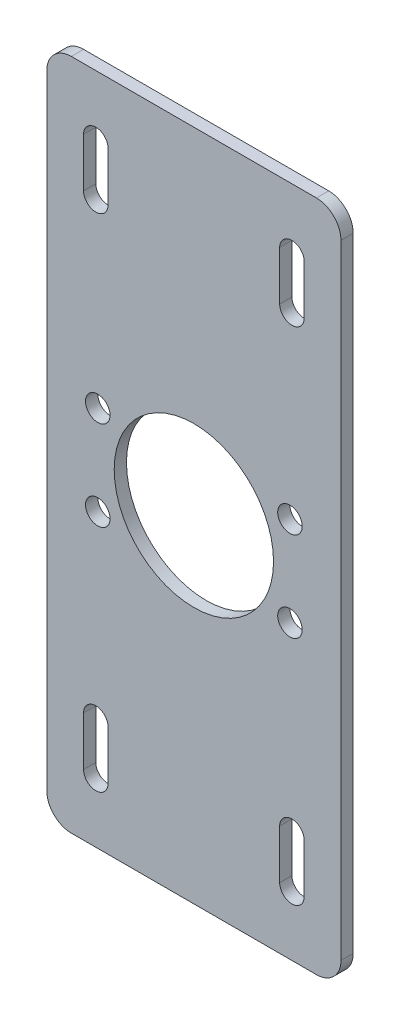
ISO-10303-21;
HEADER;
FILE_DESCRIPTION(('STEP AP214'),'2;1');
FILE_NAME('part.step','',(''),(''),'','','');
FILE_SCHEMA(('AUTOMOTIVE_DESIGN { 1 0 10303 214 1 1 1 1 }'));
ENDSEC;
DATA;
#1=APPLICATION_CONTEXT('core data for automotive mechanical design processes');
#2=APPLICATION_PROTOCOL_DEFINITION('international standard','automotive_design',2000,#1);
#3=PRODUCT_CONTEXT('',#1,'mechanical');
#4=PRODUCT('Part','Part','',(#3));
#5=PRODUCT_RELATED_PRODUCT_CATEGORY('part','',(#4));
#6=PRODUCT_DEFINITION_FORMATION('','',#4);
#7=PRODUCT_DEFINITION_CONTEXT('part definition',#1,'design');
#8=PRODUCT_DEFINITION('design','',#6,#7);
#9=PRODUCT_DEFINITION_SHAPE('','',#8);
#10=(LENGTH_UNIT() NAMED_UNIT(*) SI_UNIT(.MILLI.,.METRE.));
#11=(NAMED_UNIT(*) PLANE_ANGLE_UNIT() SI_UNIT($,.RADIAN.));
#12=(NAMED_UNIT(*) SI_UNIT($,.STERADIAN.) SOLID_ANGLE_UNIT());
#13=UNCERTAINTY_MEASURE_WITH_UNIT(LENGTH_MEASURE(1.E-05),#10,'distance_accuracy_value','');
#14=(GEOMETRIC_REPRESENTATION_CONTEXT(3) GLOBAL_UNCERTAINTY_ASSIGNED_CONTEXT((#13)) GLOBAL_UNIT_ASSIGNED_CONTEXT((#10,
#11,#12)) REPRESENTATION_CONTEXT('',''));
#15=CARTESIAN_POINT('',(0.,0.,0.));
#16=DIRECTION('',(0.,0.,1.));
#17=DIRECTION('',(1.,0.,0.));
#18=AXIS2_PLACEMENT_3D('',#15,#16,#17);
#19=CARTESIAN_POINT('',(0.,0.,171.45));
#20=DIRECTION('',(0.,0.,1.));
#21=DIRECTION('',(1.,0.,0.));
#22=AXIS2_PLACEMENT_3D('',#19,#20,#21);
#23=PLANE('',#22);
#24=CARTESIAN_POINT('',(-24.8906104862277,774.362823261769,171.45));
#25=DIRECTION('',(0.,0.,1.));
#26=DIRECTION('',(1.,0.,0.));
#27=AXIS2_PLACEMENT_3D('',#24,#25,#26);
#28=CIRCLE('',#27,3.17499999999992);
#29=CARTESIAN_POINT('',(-21.7156104862278,774.362823261769,171.45));
#30=VERTEX_POINT('',#29);
#31=EDGE_CURVE('E397',#30,#30,#28,.T.);
#32=ORIENTED_EDGE('',*,*,#31,.F.);
#33=EDGE_LOOP('',(#32));
#34=FACE_BOUND('',#33,.T.);
#35=CARTESIAN_POINT('',(24.8906104862278,774.362823261769,171.45));
#36=DIRECTION('',(0.,0.,1.));
#37=DIRECTION('',(1.,0.,0.));
#38=AXIS2_PLACEMENT_3D('',#35,#36,#37);
#39=CIRCLE('',#38,3.175);
#40=CARTESIAN_POINT('',(28.0656104862278,774.362823261769,171.45));
#41=VERTEX_POINT('',#40);
#42=EDGE_CURVE('E409',#41,#41,#39,.T.);
#43=ORIENTED_EDGE('',*,*,#42,.F.);
#44=EDGE_LOOP('',(#43));
#45=FACE_BOUND('',#44,.T.);
#46=CARTESIAN_POINT('',(-1.32116539930394E-11,762.756140975981,171.45));
#47=DIRECTION('',(0.,0.,1.));
#48=DIRECTION('',(1.,0.,0.));
#49=AXIS2_PLACEMENT_3D('',#46,#47,#48);
#50=CIRCLE('',#49,20.6374999999856);
#51=CARTESIAN_POINT('',(20.6374999999724,762.756140975981,171.45));
#52=VERTEX_POINT('',#51);
#53=EDGE_CURVE('E415',#52,#52,#50,.T.);
#54=ORIENTED_EDGE('',*,*,#53,.F.);
#55=EDGE_LOOP('',(#54));
#56=FACE_BOUND('',#55,.T.);
#57=CARTESIAN_POINT('',(24.8906104862278,751.149458690006,171.45));
#58=DIRECTION('',(0.,0.,1.));
#59=DIRECTION('',(1.,0.,0.));
#60=AXIS2_PLACEMENT_3D('',#57,#58,#59);
#61=CIRCLE('',#60,3.175);
#62=CARTESIAN_POINT('',(28.0656104862278,751.149458690006,171.45));
#63=VERTEX_POINT('',#62);
#64=EDGE_CURVE('E403',#63,#63,#61,.T.);
#65=ORIENTED_EDGE('',*,*,#64,.F.);
#66=EDGE_LOOP('',(#65));
#67=FACE_BOUND('',#66,.T.);
#68=CARTESIAN_POINT('',(-24.8906104862278,751.149458690006,171.45));
#69=DIRECTION('',(0.,0.,1.));
#70=DIRECTION('',(1.,0.,0.));
#71=AXIS2_PLACEMENT_3D('',#68,#69,#70);
#72=CIRCLE('',#71,3.17499999999996);
#73=CARTESIAN_POINT('',(-21.7156104862278,751.149458690006,171.45));
#74=VERTEX_POINT('',#73);
#75=EDGE_CURVE('E391',#74,#74,#72,.T.);
#76=ORIENTED_EDGE('',*,*,#75,.F.);
#77=EDGE_LOOP('',(#76));
#78=FACE_BOUND('',#77,.T.);
#79=DIRECTION('',(0.,-1.,0.));
#80=VECTOR('',#79,1.);
#81=CARTESIAN_POINT('',(-38.1000000000132,788.156140975981,171.45));
#82=LINE('',#81,#80);
#83=CARTESIAN_POINT('',(-38.1000000000132,843.534602814826,171.45));
#84=VERTEX_POINT('',#83);
#85=CARTESIAN_POINT('',(-38.1000000000132,681.977679137135,171.45));
#86=VERTEX_POINT('',#85);
#87=EDGE_CURVE('E12',#84,#86,#82,.T.);
#88=ORIENTED_EDGE('',*,*,#87,.T.);
#89=CARTESIAN_POINT('',(-31.7500000000132,681.977679137135,171.45));
#90=DIRECTION('',(0.,0.,-1.));
#91=DIRECTION('',(0.,1.,0.));
#92=AXIS2_PLACEMENT_3D('',#89,#90,#91);
#93=CIRCLE('',#92,6.35);
#94=CARTESIAN_POINT('',(-31.7500000000132,675.627679137134,171.45));
#95=VERTEX_POINT('',#94);
#96=EDGE_CURVE('E316',#86,#95,#93,.F.);
#97=ORIENTED_EDGE('',*,*,#96,.T.);
#98=DIRECTION('',(1.,0.,0.));
#99=VECTOR('',#98,1.);
#100=CARTESIAN_POINT('',(38.0999999999867,675.627679137134,171.45));
#101=LINE('',#100,#99);
#102=CARTESIAN_POINT('',(31.7499999999867,675.627679137134,171.45));
#103=VERTEX_POINT('',#102);
#104=EDGE_CURVE('E321',#95,#103,#101,.T.);
#105=ORIENTED_EDGE('',*,*,#104,.T.);
#106=CARTESIAN_POINT('',(31.7499999999867,681.977679137135,171.45));
#107=DIRECTION('',(0.,0.,-1.));
#108=DIRECTION('',(0.,1.,0.));
#109=AXIS2_PLACEMENT_3D('',#106,#107,#108);
#110=CIRCLE('',#109,6.35);
#111=CARTESIAN_POINT('',(38.0999999999867,681.977679137135,171.45));
#112=VERTEX_POINT('',#111);
#113=EDGE_CURVE('E318',#103,#112,#110,.F.);
#114=ORIENTED_EDGE('',*,*,#113,.T.);
#115=DIRECTION('',(0.,1.,0.));
#116=VECTOR('',#115,1.);
#117=CARTESIAN_POINT('',(38.0999999999868,737.356140975981,171.45));
#118=LINE('',#117,#116);
#119=CARTESIAN_POINT('',(38.0999999999868,843.534602814826,171.45));
#120=VERTEX_POINT('',#119);
#121=EDGE_CURVE('E53',#112,#120,#118,.T.);
#122=ORIENTED_EDGE('',*,*,#121,.T.);
#123=CARTESIAN_POINT('',(31.7499999999868,843.534602814826,171.45));
#124=DIRECTION('',(0.,0.,-1.));
#125=DIRECTION('',(0.,1.,0.));
#126=AXIS2_PLACEMENT_3D('',#123,#124,#125);
#127=CIRCLE('',#126,6.35);
#128=CARTESIAN_POINT('',(31.7499999999868,849.884602814827,171.45));
#129=VERTEX_POINT('',#128);
#130=EDGE_CURVE('E241',#120,#129,#127,.F.);
#131=ORIENTED_EDGE('',*,*,#130,.T.);
#132=DIRECTION('',(-1.,0.,0.));
#133=VECTOR('',#132,1.);
#134=CARTESIAN_POINT('',(-38.1000000000132,849.884602814827,171.45));
#135=LINE('',#134,#133);
#136=CARTESIAN_POINT('',(-31.7500000000132,849.884602814827,171.45));
#137=VERTEX_POINT('',#136);
#138=EDGE_CURVE('E239',#129,#137,#135,.T.);
#139=ORIENTED_EDGE('',*,*,#138,.T.);
#140=CARTESIAN_POINT('',(-31.7500000000132,843.534602814826,171.45));
#141=DIRECTION('',(0.,0.,-1.));
#142=DIRECTION('',(0.,1.,0.));
#143=AXIS2_PLACEMENT_3D('',#140,#141,#142);
#144=CIRCLE('',#143,6.35);
#145=EDGE_CURVE('E237',#137,#84,#144,.F.);
#146=ORIENTED_EDGE('',*,*,#145,.T.);
#147=EDGE_LOOP('',(#88,#97,#105,#114,#122,#131,#139,#146));
#148=FACE_BOUND('',#147,.T.);
#149=DIRECTION('',(0.,1.,0.));
#150=VECTOR('',#149,1.);
#151=CARTESIAN_POINT('',(-28.5750000000132,704.202679137135,171.45));
#152=LINE('',#151,#150);
#153=CARTESIAN_POINT('',(-28.5750000000132,691.502679137134,171.45));
#154=VERTEX_POINT('',#153);
#155=CARTESIAN_POINT('',(-28.5750000000132,704.202679137135,171.45));
#156=VERTEX_POINT('',#155);
#157=EDGE_CURVE('E345',#154,#156,#152,.T.);
#158=ORIENTED_EDGE('',*,*,#157,.T.);
#159=CARTESIAN_POINT('',(-25.4000000000132,704.202679137135,171.45));
#160=DIRECTION('',(0.,0.,-1.));
#161=DIRECTION('',(0.,1.,0.));
#162=AXIS2_PLACEMENT_3D('',#159,#160,#161);
#163=CIRCLE('',#162,3.175);
#164=CARTESIAN_POINT('',(-22.2250000000132,704.202679137135,171.45));
#165=VERTEX_POINT('',#164);
#166=EDGE_CURVE('E342',#156,#165,#163,.T.);
#167=ORIENTED_EDGE('',*,*,#166,.T.);
#168=DIRECTION('',(0.,-1.,0.));
#169=VECTOR('',#168,1.);
#170=CARTESIAN_POINT('',(-22.2250000000132,704.202679137135,171.45));
#171=LINE('',#170,#169);
#172=CARTESIAN_POINT('',(-22.2250000000132,691.502679137134,171.45));
#173=VERTEX_POINT('',#172);
#174=EDGE_CURVE('E339',#165,#173,#171,.T.);
#175=ORIENTED_EDGE('',*,*,#174,.T.);
#176=CARTESIAN_POINT('',(-25.4000000000132,691.502679137134,171.45));
#177=DIRECTION('',(0.,0.,-1.));
#178=DIRECTION('',(0.,1.,0.));
#179=AXIS2_PLACEMENT_3D('',#176,#177,#178);
#180=CIRCLE('',#179,3.175);
#181=EDGE_CURVE('E336',#173,#154,#180,.T.);
#182=ORIENTED_EDGE('',*,*,#181,.T.);
#183=EDGE_LOOP('',(#158,#167,#175,#182));
#184=FACE_BOUND('',#183,.T.);
#185=DIRECTION('',(0.,1.,0.));
#186=VECTOR('',#185,1.);
#187=CARTESIAN_POINT('',(22.2250000000132,704.202679137135,171.45));
#188=LINE('',#187,#186);
#189=CARTESIAN_POINT('',(22.2250000000132,691.502679137134,171.45));
#190=VERTEX_POINT('',#189);
#191=CARTESIAN_POINT('',(22.2250000000132,704.202679137135,171.45));
#192=VERTEX_POINT('',#191);
#193=EDGE_CURVE('E333',#190,#192,#188,.T.);
#194=ORIENTED_EDGE('',*,*,#193,.T.);
#195=CARTESIAN_POINT('',(25.4000000000132,704.202679137135,171.45));
#196=DIRECTION('',(0.,0.,-1.));
#197=DIRECTION('',(0.,-1.,0.));
#198=AXIS2_PLACEMENT_3D('',#195,#196,#197);
#199=CIRCLE('',#198,3.175);
#200=CARTESIAN_POINT('',(28.5750000000132,704.202679137135,171.45));
#201=VERTEX_POINT('',#200);
#202=EDGE_CURVE('E330',#192,#201,#199,.T.);
#203=ORIENTED_EDGE('',*,*,#202,.T.);
#204=DIRECTION('',(0.,-1.,0.));
#205=VECTOR('',#204,1.);
#206=CARTESIAN_POINT('',(28.5750000000132,704.202679137135,171.45));
#207=LINE('',#206,#205);
#208=CARTESIAN_POINT('',(28.5750000000132,691.502679137134,171.45));
#209=VERTEX_POINT('',#208);
#210=EDGE_CURVE('E327',#201,#209,#207,.T.);
#211=ORIENTED_EDGE('',*,*,#210,.T.);
#212=CARTESIAN_POINT('',(25.4000000000132,691.502679137134,171.45));
#213=DIRECTION('',(0.,0.,-1.));
#214=DIRECTION('',(0.,-1.,0.));
#215=AXIS2_PLACEMENT_3D('',#212,#213,#214);
#216=CIRCLE('',#215,3.175);
#217=EDGE_CURVE('E324',#209,#190,#216,.T.);
#218=ORIENTED_EDGE('',*,*,#217,.T.);
#219=EDGE_LOOP('',(#194,#203,#211,#218));
#220=FACE_BOUND('',#219,.T.);
#221=DIRECTION('',(0.,1.,0.));
#222=VECTOR('',#221,1.);
#223=CARTESIAN_POINT('',(-22.2250000000132,821.309602814827,171.45));
#224=LINE('',#223,#222);
#225=CARTESIAN_POINT('',(-22.2250000000132,821.309602814827,171.45));
#226=VERTEX_POINT('',#225);
#227=CARTESIAN_POINT('',(-22.2250000000132,834.009602814827,171.45));
#228=VERTEX_POINT('',#227);
#229=EDGE_CURVE('E243',#226,#228,#224,.T.);
#230=ORIENTED_EDGE('',*,*,#229,.F.);
#231=CARTESIAN_POINT('',(-25.4000000000132,821.309602814827,171.45));
#232=DIRECTION('',(0.,0.,1.));
#233=DIRECTION('',(0.,-1.,0.));
#234=AXIS2_PLACEMENT_3D('',#231,#232,#233);
#235=CIRCLE('',#234,3.175);
#236=CARTESIAN_POINT('',(-28.5750000000132,821.309602814827,171.45));
#237=VERTEX_POINT('',#236);
#238=EDGE_CURVE('E251',#237,#226,#235,.T.);
#239=ORIENTED_EDGE('',*,*,#238,.F.);
#240=DIRECTION('',(0.,-1.,0.));
#241=VECTOR('',#240,1.);
#242=CARTESIAN_POINT('',(-28.5750000000132,821.309602814827,171.45));
#243=LINE('',#242,#241);
#244=CARTESIAN_POINT('',(-28.5750000000132,834.009602814827,171.45));
#245=VERTEX_POINT('',#244);
#246=EDGE_CURVE('E257',#245,#237,#243,.T.);
#247=ORIENTED_EDGE('',*,*,#246,.F.);
#248=CARTESIAN_POINT('',(-25.4000000000132,834.009602814827,171.45));
#249=DIRECTION('',(0.,0.,1.));
#250=DIRECTION('',(0.,-1.,0.));
#251=AXIS2_PLACEMENT_3D('',#248,#249,#250);
#252=CIRCLE('',#251,3.175);
#253=EDGE_CURVE('E264',#228,#245,#252,.T.);
#254=ORIENTED_EDGE('',*,*,#253,.F.);
#255=EDGE_LOOP('',(#230,#239,#247,#254));
#256=FACE_BOUND('',#255,.T.);
#257=DIRECTION('',(0.,1.,0.));
#258=VECTOR('',#257,1.);
#259=CARTESIAN_POINT('',(28.5750000000132,821.309602814827,171.45));
#260=LINE('',#259,#258);
#261=CARTESIAN_POINT('',(28.5750000000132,821.309602814827,171.45));
#262=VERTEX_POINT('',#261);
#263=CARTESIAN_POINT('',(28.5750000000132,834.009602814827,171.45));
#264=VERTEX_POINT('',#263);
#265=EDGE_CURVE('E272',#262,#264,#260,.T.);
#266=ORIENTED_EDGE('',*,*,#265,.F.);
#267=CARTESIAN_POINT('',(25.4000000000132,821.309602814827,171.45));
#268=DIRECTION('',(0.,0.,1.));
#269=DIRECTION('',(0.,1.,0.));
#270=AXIS2_PLACEMENT_3D('',#267,#268,#269);
#271=CIRCLE('',#270,3.175);
#272=CARTESIAN_POINT('',(22.2250000000132,821.309602814827,171.45));
#273=VERTEX_POINT('',#272);
#274=EDGE_CURVE('E280',#273,#262,#271,.T.);
#275=ORIENTED_EDGE('',*,*,#274,.F.);
#276=DIRECTION('',(0.,-1.,0.));
#277=VECTOR('',#276,1.);
#278=CARTESIAN_POINT('',(22.2250000000132,821.309602814827,171.45));
#279=LINE('',#278,#277);
#280=CARTESIAN_POINT('',(22.2250000000132,834.009602814827,171.45));
#281=VERTEX_POINT('',#280);
#282=EDGE_CURVE('E286',#281,#273,#279,.T.);
#283=ORIENTED_EDGE('',*,*,#282,.F.);
#284=CARTESIAN_POINT('',(25.4000000000132,834.009602814827,171.45));
#285=DIRECTION('',(0.,0.,1.));
#286=DIRECTION('',(0.,1.,0.));
#287=AXIS2_PLACEMENT_3D('',#284,#285,#286);
#288=CIRCLE('',#287,3.175);
#289=EDGE_CURVE('E293',#264,#281,#288,.T.);
#290=ORIENTED_EDGE('',*,*,#289,.F.);
#291=EDGE_LOOP('',(#266,#275,#283,#290));
#292=FACE_BOUND('',#291,.T.);
#293=ADVANCED_FACE('F43',(#34,#45,#56,#67,#78,#148,#184,#220,#256,#292),#23,.T.);
#294=CARTESIAN_POINT('',(0.,0.,168.275));
#295=DIRECTION('',(0.,0.,1.));
#296=DIRECTION('',(1.,0.,0.));
#297=AXIS2_PLACEMENT_3D('',#294,#295,#296);
#298=PLANE('',#297);
#299=CARTESIAN_POINT('',(-1.32116539930394E-11,762.756140975981,168.275));
#300=DIRECTION('',(0.,0.,1.));
#301=DIRECTION('',(1.,0.,0.));
#302=AXIS2_PLACEMENT_3D('',#299,#300,#301);
#303=CIRCLE('',#302,20.6374999999856);
#304=CARTESIAN_POINT('',(20.6374999999724,762.756140975981,168.275));
#305=VERTEX_POINT('',#304);
#306=EDGE_CURVE('E412',#305,#305,#303,.T.);
#307=ORIENTED_EDGE('',*,*,#306,.T.);
#308=EDGE_LOOP('',(#307));
#309=FACE_BOUND('',#308,.T.);
#310=CARTESIAN_POINT('',(24.8906104862278,774.362823261769,168.275));
#311=DIRECTION('',(0.,0.,1.));
#312=DIRECTION('',(1.,0.,0.));
#313=AXIS2_PLACEMENT_3D('',#310,#311,#312);
#314=CIRCLE('',#313,3.175);
#315=CARTESIAN_POINT('',(28.0656104862278,774.362823261769,168.275));
#316=VERTEX_POINT('',#315);
#317=EDGE_CURVE('E406',#316,#316,#314,.T.);
#318=ORIENTED_EDGE('',*,*,#317,.T.);
#319=EDGE_LOOP('',(#318));
#320=FACE_BOUND('',#319,.T.);
#321=CARTESIAN_POINT('',(24.8906104862278,751.149458690006,168.275));
#322=DIRECTION('',(0.,0.,1.));
#323=DIRECTION('',(1.,0.,0.));
#324=AXIS2_PLACEMENT_3D('',#321,#322,#323);
#325=CIRCLE('',#324,3.175);
#326=CARTESIAN_POINT('',(28.0656104862278,751.149458690006,168.275));
#327=VERTEX_POINT('',#326);
#328=EDGE_CURVE('E400',#327,#327,#325,.T.);
#329=ORIENTED_EDGE('',*,*,#328,.T.);
#330=EDGE_LOOP('',(#329));
#331=FACE_BOUND('',#330,.T.);
#332=CARTESIAN_POINT('',(-24.8906104862277,774.362823261769,168.275));
#333=DIRECTION('',(0.,0.,1.));
#334=DIRECTION('',(1.,0.,0.));
#335=AXIS2_PLACEMENT_3D('',#332,#333,#334);
#336=CIRCLE('',#335,3.17499999999992);
#337=CARTESIAN_POINT('',(-21.7156104862278,774.362823261769,168.275));
#338=VERTEX_POINT('',#337);
#339=EDGE_CURVE('E394',#338,#338,#336,.T.);
#340=ORIENTED_EDGE('',*,*,#339,.T.);
#341=EDGE_LOOP('',(#340));
#342=FACE_BOUND('',#341,.T.);
#343=CARTESIAN_POINT('',(-24.8906104862278,751.149458690006,168.275));
#344=DIRECTION('',(0.,0.,1.));
#345=DIRECTION('',(1.,0.,0.));
#346=AXIS2_PLACEMENT_3D('',#343,#344,#345);
#347=CIRCLE('',#346,3.17499999999996);
#348=CARTESIAN_POINT('',(-21.7156104862278,751.149458690006,168.275));
#349=VERTEX_POINT('',#348);
#350=EDGE_CURVE('E310',#349,#349,#347,.T.);
#351=ORIENTED_EDGE('',*,*,#350,.T.);
#352=EDGE_LOOP('',(#351));
#353=FACE_BOUND('',#352,.T.);
#354=DIRECTION('',(0.,1.,0.));
#355=VECTOR('',#354,1.);
#356=CARTESIAN_POINT('',(38.0999999999868,737.356140975981,168.275));
#357=LINE('',#356,#355);
#358=CARTESIAN_POINT('',(38.0999999999867,681.977679137134,168.275));
#359=VERTEX_POINT('',#358);
#360=CARTESIAN_POINT('',(38.0999999999868,843.534602814827,168.275));
#361=VERTEX_POINT('',#360);
#362=EDGE_CURVE('E132',#359,#361,#357,.T.);
#363=ORIENTED_EDGE('',*,*,#362,.F.);
#364=CARTESIAN_POINT('',(31.7499999999867,681.977679137134,168.275));
#365=DIRECTION('',(0.,0.,-1.));
#366=DIRECTION('',(0.,1.,0.));
#367=AXIS2_PLACEMENT_3D('',#364,#365,#366);
#368=CIRCLE('',#367,6.35);
#369=CARTESIAN_POINT('',(31.7499999999867,675.627679137134,168.275));
#370=VERTEX_POINT('',#369);
#371=EDGE_CURVE('E312',#359,#370,#368,.T.);
#372=ORIENTED_EDGE('',*,*,#371,.T.);
#373=DIRECTION('',(1.,0.,0.));
#374=VECTOR('',#373,1.);
#375=CARTESIAN_POINT('',(38.0999999999867,675.627679137134,168.275));
#376=LINE('',#375,#374);
#377=CARTESIAN_POINT('',(-31.7500000000132,675.627679137134,168.275));
#378=VERTEX_POINT('',#377);
#379=EDGE_CURVE('E227',#378,#370,#376,.T.);
#380=ORIENTED_EDGE('',*,*,#379,.F.);
#381=CARTESIAN_POINT('',(-31.7500000000132,681.977679137134,168.275));
#382=DIRECTION('',(0.,0.,-1.));
#383=DIRECTION('',(0.,1.,0.));
#384=AXIS2_PLACEMENT_3D('',#381,#382,#383);
#385=CIRCLE('',#384,6.35);
#386=CARTESIAN_POINT('',(-38.1000000000132,681.977679137134,168.275));
#387=VERTEX_POINT('',#386);
#388=EDGE_CURVE('E139',#378,#387,#385,.T.);
#389=ORIENTED_EDGE('',*,*,#388,.T.);
#390=DIRECTION('',(0.,-1.,0.));
#391=VECTOR('',#390,1.);
#392=CARTESIAN_POINT('',(-38.1000000000132,788.156140975981,168.275));
#393=LINE('',#392,#391);
#394=CARTESIAN_POINT('',(-38.1000000000132,843.534602814827,168.275));
#395=VERTEX_POINT('',#394);
#396=EDGE_CURVE('E47',#395,#387,#393,.T.);
#397=ORIENTED_EDGE('',*,*,#396,.F.);
#398=CARTESIAN_POINT('',(-31.7500000000132,843.534602814827,168.275));
#399=DIRECTION('',(0.,0.,-1.));
#400=DIRECTION('',(0.,1.,0.));
#401=AXIS2_PLACEMENT_3D('',#398,#399,#400);
#402=CIRCLE('',#401,6.35);
#403=CARTESIAN_POINT('',(-31.7500000000132,849.884602814827,168.275));
#404=VERTEX_POINT('',#403);
#405=EDGE_CURVE('E146',#395,#404,#402,.T.);
#406=ORIENTED_EDGE('',*,*,#405,.T.);
#407=DIRECTION('',(-1.,0.,0.));
#408=VECTOR('',#407,1.);
#409=CARTESIAN_POINT('',(-38.1000000000132,849.884602814827,168.275));
#410=LINE('',#409,#408);
#411=CARTESIAN_POINT('',(31.7499999999868,849.884602814827,168.275));
#412=VERTEX_POINT('',#411);
#413=EDGE_CURVE('E302',#412,#404,#410,.T.);
#414=ORIENTED_EDGE('',*,*,#413,.F.);
#415=CARTESIAN_POINT('',(31.7499999999868,843.534602814827,168.275));
#416=DIRECTION('',(0.,0.,-1.));
#417=DIRECTION('',(0.,1.,0.));
#418=AXIS2_PLACEMENT_3D('',#415,#416,#417);
#419=CIRCLE('',#418,6.35);
#420=EDGE_CURVE('E223',#412,#361,#419,.T.);
#421=ORIENTED_EDGE('',*,*,#420,.T.);
#422=EDGE_LOOP('',(#363,#372,#380,#389,#397,#406,#414,#421));
#423=FACE_BOUND('',#422,.T.);
#424=CARTESIAN_POINT('',(-25.4000000000132,704.202679137135,168.275));
#425=DIRECTION('',(0.,0.,-1.));
#426=DIRECTION('',(0.,1.,0.));
#427=AXIS2_PLACEMENT_3D('',#424,#425,#426);
#428=CIRCLE('',#427,3.175);
#429=CARTESIAN_POINT('',(-28.5750000000132,704.202679137135,168.275));
#430=VERTEX_POINT('',#429);
#431=CARTESIAN_POINT('',(-22.2250000000132,704.202679137135,168.275));
#432=VERTEX_POINT('',#431);
#433=EDGE_CURVE('E356',#430,#432,#428,.T.);
#434=ORIENTED_EDGE('',*,*,#433,.F.);
#435=DIRECTION('',(0.,1.,0.));
#436=VECTOR('',#435,1.);
#437=CARTESIAN_POINT('',(-28.5750000000132,567.677679137132,168.275000000001));
#438=LINE('',#437,#436);
#439=CARTESIAN_POINT('',(-28.5750000000132,691.502679137134,168.275));
#440=VERTEX_POINT('',#439);
#441=EDGE_CURVE('E351',#440,#430,#438,.T.);
#442=ORIENTED_EDGE('',*,*,#441,.F.);
#443=CARTESIAN_POINT('',(-25.4000000000132,691.502679137134,168.275));
#444=DIRECTION('',(0.,0.,-1.));
#445=DIRECTION('',(0.,1.,0.));
#446=AXIS2_PLACEMENT_3D('',#443,#444,#445);
#447=CIRCLE('',#446,3.175);
#448=CARTESIAN_POINT('',(-22.2250000000132,691.502679137134,168.275));
#449=VERTEX_POINT('',#448);
#450=EDGE_CURVE('E366',#449,#440,#447,.T.);
#451=ORIENTED_EDGE('',*,*,#450,.F.);
#452=DIRECTION('',(0.,-1.,0.));
#453=VECTOR('',#452,1.);
#454=CARTESIAN_POINT('',(-22.2250000000132,567.677679137132,168.275000000001));
#455=LINE('',#454,#453);
#456=EDGE_CURVE('E361',#432,#449,#455,.T.);
#457=ORIENTED_EDGE('',*,*,#456,.F.);
#458=EDGE_LOOP('',(#434,#442,#451,#457));
#459=FACE_BOUND('',#458,.T.);
#460=CARTESIAN_POINT('',(25.4000000000132,704.202679137135,168.275));
#461=DIRECTION('',(0.,0.,-1.));
#462=DIRECTION('',(0.,1.,0.));
#463=AXIS2_PLACEMENT_3D('',#460,#461,#462);
#464=CIRCLE('',#463,3.175);
#465=CARTESIAN_POINT('',(22.2250000000132,704.202679137135,168.275));
#466=VERTEX_POINT('',#465);
#467=CARTESIAN_POINT('',(28.5750000000132,704.202679137135,168.275));
#468=VERTEX_POINT('',#467);
#469=EDGE_CURVE('E376',#466,#468,#464,.T.);
#470=ORIENTED_EDGE('',*,*,#469,.F.);
#471=DIRECTION('',(0.,1.,0.));
#472=VECTOR('',#471,1.);
#473=CARTESIAN_POINT('',(22.2250000000131,567.677679137132,168.275000000001));
#474=LINE('',#473,#472);
#475=CARTESIAN_POINT('',(22.2250000000132,691.502679137134,168.275));
#476=VERTEX_POINT('',#475);
#477=EDGE_CURVE('E371',#476,#466,#474,.T.);
#478=ORIENTED_EDGE('',*,*,#477,.F.);
#479=CARTESIAN_POINT('',(25.4000000000132,691.502679137134,168.275));
#480=DIRECTION('',(0.,0.,-1.));
#481=DIRECTION('',(0.,1.,0.));
#482=AXIS2_PLACEMENT_3D('',#479,#480,#481);
#483=CIRCLE('',#482,3.175);
#484=CARTESIAN_POINT('',(28.5750000000132,691.502679137134,168.275));
#485=VERTEX_POINT('',#484);
#486=EDGE_CURVE('E386',#485,#476,#483,.T.);
#487=ORIENTED_EDGE('',*,*,#486,.F.);
#488=DIRECTION('',(0.,-1.,0.));
#489=VECTOR('',#488,1.);
#490=CARTESIAN_POINT('',(28.5750000000132,567.677679137132,168.275000000001));
#491=LINE('',#490,#489);
#492=EDGE_CURVE('E381',#468,#485,#491,.T.);
#493=ORIENTED_EDGE('',*,*,#492,.F.);
#494=EDGE_LOOP('',(#470,#478,#487,#493));
#495=FACE_BOUND('',#494,.T.);
#496=CARTESIAN_POINT('',(-25.4000000000132,821.309602814827,168.275));
#497=DIRECTION('',(0.,0.,-1.));
#498=DIRECTION('',(0.,1.,0.));
#499=AXIS2_PLACEMENT_3D('',#496,#497,#498);
#500=CIRCLE('',#499,3.175);
#501=CARTESIAN_POINT('',(-22.2250000000132,821.309602814827,168.275));
#502=VERTEX_POINT('',#501);
#503=CARTESIAN_POINT('',(-28.5750000000132,821.309602814827,168.275));
#504=VERTEX_POINT('',#503);
#505=EDGE_CURVE('E255',#502,#504,#500,.T.);
#506=ORIENTED_EDGE('',*,*,#505,.F.);
#507=DIRECTION('',(0.,-1.,0.));
#508=VECTOR('',#507,1.);
#509=CARTESIAN_POINT('',(-22.2250000000131,957.834602814824,168.275000000001));
#510=LINE('',#509,#508);
#511=CARTESIAN_POINT('',(-22.2250000000132,834.009602814827,168.275));
#512=VERTEX_POINT('',#511);
#513=EDGE_CURVE('E249',#512,#502,#510,.T.);
#514=ORIENTED_EDGE('',*,*,#513,.F.);
#515=CARTESIAN_POINT('',(-25.4000000000132,834.009602814827,168.275));
#516=DIRECTION('',(0.,0.,-1.));
#517=DIRECTION('',(0.,1.,0.));
#518=AXIS2_PLACEMENT_3D('',#515,#516,#517);
#519=CIRCLE('',#518,3.175);
#520=CARTESIAN_POINT('',(-28.5750000000132,834.009602814827,168.275));
#521=VERTEX_POINT('',#520);
#522=EDGE_CURVE('E269',#521,#512,#519,.T.);
#523=ORIENTED_EDGE('',*,*,#522,.F.);
#524=DIRECTION('',(0.,1.,0.));
#525=VECTOR('',#524,1.);
#526=CARTESIAN_POINT('',(-28.5750000000132,957.834602814824,168.275000000001));
#527=LINE('',#526,#525);
#528=EDGE_CURVE('E262',#504,#521,#527,.T.);
#529=ORIENTED_EDGE('',*,*,#528,.F.);
#530=EDGE_LOOP('',(#506,#514,#523,#529));
#531=FACE_BOUND('',#530,.T.);
#532=CARTESIAN_POINT('',(25.4000000000132,821.309602814827,168.275));
#533=DIRECTION('',(0.,0.,-1.));
#534=DIRECTION('',(0.,1.,0.));
#535=AXIS2_PLACEMENT_3D('',#532,#533,#534);
#536=CIRCLE('',#535,3.175);
#537=CARTESIAN_POINT('',(28.5750000000132,821.309602814827,168.275));
#538=VERTEX_POINT('',#537);
#539=CARTESIAN_POINT('',(22.2250000000132,821.309602814827,168.275));
#540=VERTEX_POINT('',#539);
#541=EDGE_CURVE('E284',#538,#540,#536,.T.);
#542=ORIENTED_EDGE('',*,*,#541,.F.);
#543=DIRECTION('',(0.,-1.,0.));
#544=VECTOR('',#543,1.);
#545=CARTESIAN_POINT('',(28.5750000000132,957.834602814824,168.275000000001));
#546=LINE('',#545,#544);
#547=CARTESIAN_POINT('',(28.5750000000132,834.009602814827,168.275));
#548=VERTEX_POINT('',#547);
#549=EDGE_CURVE('E278',#548,#538,#546,.T.);
#550=ORIENTED_EDGE('',*,*,#549,.F.);
#551=CARTESIAN_POINT('',(25.4000000000132,834.009602814827,168.275));
#552=DIRECTION('',(0.,0.,-1.));
#553=DIRECTION('',(0.,1.,0.));
#554=AXIS2_PLACEMENT_3D('',#551,#552,#553);
#555=CIRCLE('',#554,3.175);
#556=CARTESIAN_POINT('',(22.2250000000132,834.009602814827,168.275));
#557=VERTEX_POINT('',#556);
#558=EDGE_CURVE('E298',#557,#548,#555,.T.);
#559=ORIENTED_EDGE('',*,*,#558,.F.);
#560=DIRECTION('',(0.,1.,0.));
#561=VECTOR('',#560,1.);
#562=CARTESIAN_POINT('',(22.2250000000132,957.834602814824,168.275000000001));
#563=LINE('',#562,#561);
#564=EDGE_CURVE('E291',#540,#557,#563,.T.);
#565=ORIENTED_EDGE('',*,*,#564,.F.);
#566=EDGE_LOOP('',(#542,#550,#559,#565));
#567=FACE_BOUND('',#566,.T.);
#568=ADVANCED_FACE('F45',(#309,#320,#331,#342,#353,#423,#459,#495,#531,#567),#298,.F.);
#569=CARTESIAN_POINT('',(38.0999999999868,737.356140975981,171.45));
#570=DIRECTION('',(-1.,0.,0.));
#571=DIRECTION('',(0.,0.,1.));
#572=AXIS2_PLACEMENT_3D('',#569,#570,#571);
#573=PLANE('',#572);
#574=ORIENTED_EDGE('',*,*,#121,.F.);
#575=DIRECTION('',(0.,0.,-1.));
#576=VECTOR('',#575,1.);
#577=CARTESIAN_POINT('',(38.0999999999867,681.977679137135,171.45));
#578=LINE('',#577,#576);
#579=EDGE_CURVE('E307',#112,#359,#578,.T.);
#580=ORIENTED_EDGE('',*,*,#579,.T.);
#581=ORIENTED_EDGE('',*,*,#362,.T.);
#582=DIRECTION('',(0.,0.,-1.));
#583=VECTOR('',#582,1.);
#584=CARTESIAN_POINT('',(38.0999999999868,843.534602814826,171.45));
#585=LINE('',#584,#583);
#586=EDGE_CURVE('E234',#361,#120,#585,.F.);
#587=ORIENTED_EDGE('',*,*,#586,.T.);
#588=EDGE_LOOP('',(#574,#580,#581,#587));
#589=FACE_BOUND('',#588,.T.);
#590=ADVANCED_FACE('F421',(#589),#573,.F.);
#591=CARTESIAN_POINT('',(-38.1000000000132,788.156140975981,171.45));
#592=DIRECTION('',(1.,0.,0.));
#593=DIRECTION('',(0.,0.,-1.));
#594=AXIS2_PLACEMENT_3D('',#591,#592,#593);
#595=PLANE('',#594);
#596=ORIENTED_EDGE('',*,*,#396,.T.);
#597=DIRECTION('',(0.,0.,-1.));
#598=VECTOR('',#597,1.);
#599=CARTESIAN_POINT('',(-38.1000000000132,681.977679137135,171.45));
#600=LINE('',#599,#598);
#601=EDGE_CURVE('E314',#387,#86,#600,.F.);
#602=ORIENTED_EDGE('',*,*,#601,.T.);
#603=ORIENTED_EDGE('',*,*,#87,.F.);
#604=DIRECTION('',(0.,0.,-1.));
#605=VECTOR('',#604,1.);
#606=CARTESIAN_POINT('',(-38.1000000000132,843.534602814826,171.45));
#607=LINE('',#606,#605);
#608=EDGE_CURVE('E222',#84,#395,#607,.T.);
#609=ORIENTED_EDGE('',*,*,#608,.T.);
#610=EDGE_LOOP('',(#596,#602,#603,#609));
#611=FACE_BOUND('',#610,.T.);
#612=ADVANCED_FACE('F225',(#611),#595,.F.);
#613=CARTESIAN_POINT('',(-1.32116539930394E-11,762.756140975981,171.45));
#614=DIRECTION('',(0.,0.,-1.));
#615=DIRECTION('',(-1.,0.,0.));
#616=AXIS2_PLACEMENT_3D('',#613,#614,#615);
#617=CYLINDRICAL_SURFACE('',#616,20.6374999999856);
#618=ORIENTED_EDGE('',*,*,#53,.T.);
#619=EDGE_LOOP('',(#618));
#620=FACE_BOUND('',#619,.T.);
#621=ORIENTED_EDGE('',*,*,#306,.F.);
#622=EDGE_LOOP('',(#621));
#623=FACE_BOUND('',#622,.T.);
#624=ADVANCED_FACE('F453',(#620,#623),#617,.F.);
#625=CARTESIAN_POINT('',(24.8906104862278,774.362823261769,171.45));
#626=DIRECTION('',(0.,0.,-1.));
#627=DIRECTION('',(-1.,0.,0.));
#628=AXIS2_PLACEMENT_3D('',#625,#626,#627);
#629=CYLINDRICAL_SURFACE('',#628,3.175);
#630=ORIENTED_EDGE('',*,*,#42,.T.);
#631=EDGE_LOOP('',(#630));
#632=FACE_BOUND('',#631,.T.);
#633=ORIENTED_EDGE('',*,*,#317,.F.);
#634=EDGE_LOOP('',(#633));
#635=FACE_BOUND('',#634,.T.);
#636=ADVANCED_FACE('F475',(#632,#635),#629,.F.);
#637=CARTESIAN_POINT('',(24.8906104862278,751.149458690006,171.45));
#638=DIRECTION('',(0.,0.,-1.));
#639=DIRECTION('',(-1.,0.,0.));
#640=AXIS2_PLACEMENT_3D('',#637,#638,#639);
#641=CYLINDRICAL_SURFACE('',#640,3.175);
#642=ORIENTED_EDGE('',*,*,#64,.T.);
#643=EDGE_LOOP('',(#642));
#644=FACE_BOUND('',#643,.T.);
#645=ORIENTED_EDGE('',*,*,#328,.F.);
#646=EDGE_LOOP('',(#645));
#647=FACE_BOUND('',#646,.T.);
#648=ADVANCED_FACE('F482',(#644,#647),#641,.F.);
#649=CARTESIAN_POINT('',(-24.8906104862277,774.362823261769,171.45));
#650=DIRECTION('',(0.,0.,-1.));
#651=DIRECTION('',(-1.,0.,0.));
#652=AXIS2_PLACEMENT_3D('',#649,#650,#651);
#653=CYLINDRICAL_SURFACE('',#652,3.17499999999992);
#654=ORIENTED_EDGE('',*,*,#31,.T.);
#655=EDGE_LOOP('',(#654));
#656=FACE_BOUND('',#655,.T.);
#657=ORIENTED_EDGE('',*,*,#339,.F.);
#658=EDGE_LOOP('',(#657));
#659=FACE_BOUND('',#658,.T.);
#660=ADVANCED_FACE('F489',(#656,#659),#653,.F.);
#661=CARTESIAN_POINT('',(-24.8906104862278,751.149458690006,171.45));
#662=DIRECTION('',(0.,0.,-1.));
#663=DIRECTION('',(-1.,0.,0.));
#664=AXIS2_PLACEMENT_3D('',#661,#662,#663);
#665=CYLINDRICAL_SURFACE('',#664,3.17499999999996);
#666=ORIENTED_EDGE('',*,*,#75,.T.);
#667=EDGE_LOOP('',(#666));
#668=FACE_BOUND('',#667,.T.);
#669=ORIENTED_EDGE('',*,*,#350,.F.);
#670=EDGE_LOOP('',(#669));
#671=FACE_BOUND('',#670,.T.);
#672=ADVANCED_FACE('F497',(#668,#671),#665,.F.);
#673=CARTESIAN_POINT('',(-31.7500000000132,681.977679137135,171.45));
#674=DIRECTION('',(0.,0.,-1.));
#675=DIRECTION('',(0.,1.,0.));
#676=AXIS2_PLACEMENT_3D('',#673,#674,#675);
#677=CYLINDRICAL_SURFACE('',#676,6.35);
#678=ORIENTED_EDGE('',*,*,#96,.F.);
#679=ORIENTED_EDGE('',*,*,#601,.F.);
#680=ORIENTED_EDGE('',*,*,#388,.F.);
#681=DIRECTION('',(0.,0.,-1.));
#682=VECTOR('',#681,1.);
#683=CARTESIAN_POINT('',(-31.7500000000132,675.627679137134,171.45));
#684=LINE('',#683,#682);
#685=EDGE_CURVE('E388',#95,#378,#684,.T.);
#686=ORIENTED_EDGE('',*,*,#685,.F.);
#687=EDGE_LOOP('',(#678,#679,#680,#686));
#688=FACE_BOUND('',#687,.T.);
#689=ADVANCED_FACE('F505',(#688),#677,.T.);
#690=CARTESIAN_POINT('',(31.7499999999867,681.977679137135,171.45));
#691=DIRECTION('',(0.,0.,-1.));
#692=DIRECTION('',(0.,1.,0.));
#693=AXIS2_PLACEMENT_3D('',#690,#691,#692);
#694=CYLINDRICAL_SURFACE('',#693,6.35);
#695=ORIENTED_EDGE('',*,*,#113,.F.);
#696=DIRECTION('',(0.,0.,-1.));
#697=VECTOR('',#696,1.);
#698=CARTESIAN_POINT('',(31.7499999999867,675.627679137134,171.45));
#699=LINE('',#698,#697);
#700=EDGE_CURVE('E230',#370,#103,#699,.F.);
#701=ORIENTED_EDGE('',*,*,#700,.F.);
#702=ORIENTED_EDGE('',*,*,#371,.F.);
#703=ORIENTED_EDGE('',*,*,#579,.F.);
#704=EDGE_LOOP('',(#695,#701,#702,#703));
#705=FACE_BOUND('',#704,.T.);
#706=ADVANCED_FACE('F513',(#705),#694,.T.);
#707=CARTESIAN_POINT('',(38.0999999999867,675.627679137134,171.45));
#708=DIRECTION('',(0.,1.,0.));
#709=DIRECTION('',(0.,0.,1.));
#710=AXIS2_PLACEMENT_3D('',#707,#708,#709);
#711=PLANE('',#710);
#712=ORIENTED_EDGE('',*,*,#379,.T.);
#713=ORIENTED_EDGE('',*,*,#700,.T.);
#714=ORIENTED_EDGE('',*,*,#104,.F.);
#715=ORIENTED_EDGE('',*,*,#685,.T.);
#716=EDGE_LOOP('',(#712,#713,#714,#715));
#717=FACE_BOUND('',#716,.T.);
#718=ADVANCED_FACE('F520',(#717),#711,.F.);
#719=CARTESIAN_POINT('',(25.4000000000132,691.502679137134,171.45));
#720=DIRECTION('',(0.,0.,-1.));
#721=DIRECTION('',(0.,1.,0.));
#722=AXIS2_PLACEMENT_3D('',#719,#720,#721);
#723=CYLINDRICAL_SURFACE('',#722,3.175);
#724=ORIENTED_EDGE('',*,*,#486,.T.);
#725=DIRECTION('',(0.,0.,-1.));
#726=VECTOR('',#725,1.);
#727=CARTESIAN_POINT('',(22.2250000000132,691.502679137134,171.45));
#728=LINE('',#727,#726);
#729=EDGE_CURVE('E368',#190,#476,#728,.T.);
#730=ORIENTED_EDGE('',*,*,#729,.F.);
#731=ORIENTED_EDGE('',*,*,#217,.F.);
#732=DIRECTION('',(0.,0.,-1.));
#733=VECTOR('',#732,1.);
#734=CARTESIAN_POINT('',(28.5750000000132,691.502679137134,171.45));
#735=LINE('',#734,#733);
#736=EDGE_CURVE('E383',#209,#485,#735,.T.);
#737=ORIENTED_EDGE('',*,*,#736,.T.);
#738=EDGE_LOOP('',(#724,#730,#731,#737));
#739=FACE_BOUND('',#738,.T.);
#740=ADVANCED_FACE('F528',(#739),#723,.F.);
#741=CARTESIAN_POINT('',(28.5750000000132,704.202679137135,171.45));
#742=DIRECTION('',(1.,0.,0.));
#743=DIRECTION('',(0.,-1.,0.));
#744=AXIS2_PLACEMENT_3D('',#741,#742,#743);
#745=PLANE('',#744);
#746=ORIENTED_EDGE('',*,*,#492,.T.);
#747=ORIENTED_EDGE('',*,*,#736,.F.);
#748=ORIENTED_EDGE('',*,*,#210,.F.);
#749=DIRECTION('',(0.,0.,-1.));
#750=VECTOR('',#749,1.);
#751=CARTESIAN_POINT('',(28.5750000000132,704.202679137135,171.45));
#752=LINE('',#751,#750);
#753=EDGE_CURVE('E379',#201,#468,#752,.T.);
#754=ORIENTED_EDGE('',*,*,#753,.T.);
#755=EDGE_LOOP('',(#746,#747,#748,#754));
#756=FACE_BOUND('',#755,.T.);
#757=ADVANCED_FACE('F536',(#756),#745,.F.);
#758=CARTESIAN_POINT('',(25.4000000000132,704.202679137135,171.45));
#759=DIRECTION('',(0.,0.,-1.));
#760=DIRECTION('',(0.,1.,0.));
#761=AXIS2_PLACEMENT_3D('',#758,#759,#760);
#762=CYLINDRICAL_SURFACE('',#761,3.175);
#763=ORIENTED_EDGE('',*,*,#469,.T.);
#764=ORIENTED_EDGE('',*,*,#753,.F.);
#765=ORIENTED_EDGE('',*,*,#202,.F.);
#766=DIRECTION('',(0.,0.,-1.));
#767=VECTOR('',#766,1.);
#768=CARTESIAN_POINT('',(22.2250000000132,704.202679137135,171.45));
#769=LINE('',#768,#767);
#770=EDGE_CURVE('E373',#192,#466,#769,.T.);
#771=ORIENTED_EDGE('',*,*,#770,.T.);
#772=EDGE_LOOP('',(#763,#764,#765,#771));
#773=FACE_BOUND('',#772,.T.);
#774=ADVANCED_FACE('F544',(#773),#762,.F.);
#775=CARTESIAN_POINT('',(22.2250000000132,704.202679137135,171.45));
#776=DIRECTION('',(-1.,0.,0.));
#777=DIRECTION('',(0.,1.,0.));
#778=AXIS2_PLACEMENT_3D('',#775,#776,#777);
#779=PLANE('',#778);
#780=ORIENTED_EDGE('',*,*,#477,.T.);
#781=ORIENTED_EDGE('',*,*,#770,.F.);
#782=ORIENTED_EDGE('',*,*,#193,.F.);
#783=ORIENTED_EDGE('',*,*,#729,.T.);
#784=EDGE_LOOP('',(#780,#781,#782,#783));
#785=FACE_BOUND('',#784,.T.);
#786=ADVANCED_FACE('F552',(#785),#779,.F.);
#787=CARTESIAN_POINT('',(-25.4000000000132,691.502679137134,171.45));
#788=DIRECTION('',(0.,0.,-1.));
#789=DIRECTION('',(0.,1.,0.));
#790=AXIS2_PLACEMENT_3D('',#787,#788,#789);
#791=CYLINDRICAL_SURFACE('',#790,3.175);
#792=ORIENTED_EDGE('',*,*,#450,.T.);
#793=DIRECTION('',(0.,0.,-1.));
#794=VECTOR('',#793,1.);
#795=CARTESIAN_POINT('',(-28.5750000000132,691.502679137134,171.45));
#796=LINE('',#795,#794);
#797=EDGE_CURVE('E348',#154,#440,#796,.T.);
#798=ORIENTED_EDGE('',*,*,#797,.F.);
#799=ORIENTED_EDGE('',*,*,#181,.F.);
#800=DIRECTION('',(0.,0.,-1.));
#801=VECTOR('',#800,1.);
#802=CARTESIAN_POINT('',(-22.2250000000132,691.502679137134,171.45));
#803=LINE('',#802,#801);
#804=EDGE_CURVE('E363',#173,#449,#803,.T.);
#805=ORIENTED_EDGE('',*,*,#804,.T.);
#806=EDGE_LOOP('',(#792,#798,#799,#805));
#807=FACE_BOUND('',#806,.T.);
#808=ADVANCED_FACE('F560',(#807),#791,.F.);
#809=CARTESIAN_POINT('',(-22.2250000000132,704.202679137135,171.45));
#810=DIRECTION('',(1.,0.,0.));
#811=DIRECTION('',(0.,-1.,0.));
#812=AXIS2_PLACEMENT_3D('',#809,#810,#811);
#813=PLANE('',#812);
#814=ORIENTED_EDGE('',*,*,#456,.T.);
#815=ORIENTED_EDGE('',*,*,#804,.F.);
#816=ORIENTED_EDGE('',*,*,#174,.F.);
#817=DIRECTION('',(0.,0.,-1.));
#818=VECTOR('',#817,1.);
#819=CARTESIAN_POINT('',(-22.2250000000132,704.202679137135,171.45));
#820=LINE('',#819,#818);
#821=EDGE_CURVE('E359',#165,#432,#820,.T.);
#822=ORIENTED_EDGE('',*,*,#821,.T.);
#823=EDGE_LOOP('',(#814,#815,#816,#822));
#824=FACE_BOUND('',#823,.T.);
#825=ADVANCED_FACE('F568',(#824),#813,.F.);
#826=CARTESIAN_POINT('',(-25.4000000000132,704.202679137135,171.45));
#827=DIRECTION('',(0.,0.,-1.));
#828=DIRECTION('',(0.,1.,0.));
#829=AXIS2_PLACEMENT_3D('',#826,#827,#828);
#830=CYLINDRICAL_SURFACE('',#829,3.175);
#831=ORIENTED_EDGE('',*,*,#433,.T.);
#832=ORIENTED_EDGE('',*,*,#821,.F.);
#833=ORIENTED_EDGE('',*,*,#166,.F.);
#834=DIRECTION('',(0.,0.,-1.));
#835=VECTOR('',#834,1.);
#836=CARTESIAN_POINT('',(-28.5750000000132,704.202679137135,171.45));
#837=LINE('',#836,#835);
#838=EDGE_CURVE('E353',#156,#430,#837,.T.);
#839=ORIENTED_EDGE('',*,*,#838,.T.);
#840=EDGE_LOOP('',(#831,#832,#833,#839));
#841=FACE_BOUND('',#840,.T.);
#842=ADVANCED_FACE('F576',(#841),#830,.F.);
#843=CARTESIAN_POINT('',(-28.5750000000132,704.202679137135,171.45));
#844=DIRECTION('',(-1.,0.,0.));
#845=DIRECTION('',(0.,1.,0.));
#846=AXIS2_PLACEMENT_3D('',#843,#844,#845);
#847=PLANE('',#846);
#848=ORIENTED_EDGE('',*,*,#441,.T.);
#849=ORIENTED_EDGE('',*,*,#838,.F.);
#850=ORIENTED_EDGE('',*,*,#157,.F.);
#851=ORIENTED_EDGE('',*,*,#797,.T.);
#852=EDGE_LOOP('',(#848,#849,#850,#851));
#853=FACE_BOUND('',#852,.T.);
#854=ADVANCED_FACE('F439',(#853),#847,.F.);
#855=CARTESIAN_POINT('',(-31.7500000000132,843.534602814826,171.45));
#856=DIRECTION('',(0.,0.,-1.));
#857=DIRECTION('',(0.,1.,0.));
#858=AXIS2_PLACEMENT_3D('',#855,#856,#857);
#859=CYLINDRICAL_SURFACE('',#858,6.35);
#860=ORIENTED_EDGE('',*,*,#145,.F.);
#861=DIRECTION('',(0.,0.,-1.));
#862=VECTOR('',#861,1.);
#863=CARTESIAN_POINT('',(-31.7500000000132,849.884602814827,171.45));
#864=LINE('',#863,#862);
#865=EDGE_CURVE('E214',#404,#137,#864,.F.);
#866=ORIENTED_EDGE('',*,*,#865,.F.);
#867=ORIENTED_EDGE('',*,*,#405,.F.);
#868=ORIENTED_EDGE('',*,*,#608,.F.);
#869=EDGE_LOOP('',(#860,#866,#867,#868));
#870=FACE_BOUND('',#869,.T.);
#871=ADVANCED_FACE('F221',(#870),#859,.T.);
#872=CARTESIAN_POINT('',(-38.1000000000132,849.884602814827,171.45));
#873=DIRECTION('',(0.,-1.,0.));
#874=DIRECTION('',(0.,0.,-1.));
#875=AXIS2_PLACEMENT_3D('',#872,#873,#874);
#876=PLANE('',#875);
#877=ORIENTED_EDGE('',*,*,#138,.F.);
#878=DIRECTION('',(0.,0.,-1.));
#879=VECTOR('',#878,1.);
#880=CARTESIAN_POINT('',(31.7499999999868,849.884602814827,171.45));
#881=LINE('',#880,#879);
#882=EDGE_CURVE('E304',#129,#412,#881,.T.);
#883=ORIENTED_EDGE('',*,*,#882,.T.);
#884=ORIENTED_EDGE('',*,*,#413,.T.);
#885=ORIENTED_EDGE('',*,*,#865,.T.);
#886=EDGE_LOOP('',(#877,#883,#884,#885));
#887=FACE_BOUND('',#886,.T.);
#888=ADVANCED_FACE('F430',(#887),#876,.F.);
#889=CARTESIAN_POINT('',(31.7499999999868,843.534602814826,171.45));
#890=DIRECTION('',(0.,0.,-1.));
#891=DIRECTION('',(0.,1.,0.));
#892=AXIS2_PLACEMENT_3D('',#889,#890,#891);
#893=CYLINDRICAL_SURFACE('',#892,6.35);
#894=ORIENTED_EDGE('',*,*,#130,.F.);
#895=ORIENTED_EDGE('',*,*,#586,.F.);
#896=ORIENTED_EDGE('',*,*,#420,.F.);
#897=ORIENTED_EDGE('',*,*,#882,.F.);
#898=EDGE_LOOP('',(#894,#895,#896,#897));
#899=FACE_BOUND('',#898,.T.);
#900=ADVANCED_FACE('F427',(#899),#893,.T.);
#901=CARTESIAN_POINT('',(25.4000000000132,834.009602814827,114.3));
#902=DIRECTION('',(0.,0.,1.));
#903=DIRECTION('',(0.,-1.,0.));
#904=AXIS2_PLACEMENT_3D('',#901,#902,#903);
#905=CYLINDRICAL_SURFACE('',#904,3.175);
#906=ORIENTED_EDGE('',*,*,#558,.T.);
#907=DIRECTION('',(0.,0.,1.));
#908=VECTOR('',#907,1.);
#909=CARTESIAN_POINT('',(28.5750000000132,834.009602814827,114.3));
#910=LINE('',#909,#908);
#911=EDGE_CURVE('E296',#548,#264,#910,.T.);
#912=ORIENTED_EDGE('',*,*,#911,.T.);
#913=ORIENTED_EDGE('',*,*,#289,.T.);
#914=DIRECTION('',(0.,0.,1.));
#915=VECTOR('',#914,1.);
#916=CARTESIAN_POINT('',(22.2250000000132,834.009602814827,114.3));
#917=LINE('',#916,#915);
#918=EDGE_CURVE('E289',#557,#281,#917,.T.);
#919=ORIENTED_EDGE('',*,*,#918,.F.);
#920=EDGE_LOOP('',(#906,#912,#913,#919));
#921=FACE_BOUND('',#920,.T.);
#922=ADVANCED_FACE('F437',(#921),#905,.F.);
#923=CARTESIAN_POINT('',(22.2250000000132,821.309602814827,114.3));
#924=DIRECTION('',(-1.,0.,0.));
#925=DIRECTION('',(0.,-1.,0.));
#926=AXIS2_PLACEMENT_3D('',#923,#924,#925);
#927=PLANE('',#926);
#928=ORIENTED_EDGE('',*,*,#564,.T.);
#929=ORIENTED_EDGE('',*,*,#918,.T.);
#930=ORIENTED_EDGE('',*,*,#282,.T.);
#931=DIRECTION('',(0.,0.,1.));
#932=VECTOR('',#931,1.);
#933=CARTESIAN_POINT('',(22.2250000000132,821.309602814827,114.3));
#934=LINE('',#933,#932);
#935=EDGE_CURVE('E282',#540,#273,#934,.T.);
#936=ORIENTED_EDGE('',*,*,#935,.F.);
#937=EDGE_LOOP('',(#928,#929,#930,#936));
#938=FACE_BOUND('',#937,.T.);
#939=ADVANCED_FACE('F616',(#938),#927,.F.);
#940=CARTESIAN_POINT('',(25.4000000000132,821.309602814827,114.3));
#941=DIRECTION('',(0.,0.,1.));
#942=DIRECTION('',(0.,-1.,0.));
#943=AXIS2_PLACEMENT_3D('',#940,#941,#942);
#944=CYLINDRICAL_SURFACE('',#943,3.175);
#945=ORIENTED_EDGE('',*,*,#541,.T.);
#946=ORIENTED_EDGE('',*,*,#935,.T.);
#947=ORIENTED_EDGE('',*,*,#274,.T.);
#948=DIRECTION('',(0.,0.,1.));
#949=VECTOR('',#948,1.);
#950=CARTESIAN_POINT('',(28.5750000000132,821.309602814827,114.3));
#951=LINE('',#950,#949);
#952=EDGE_CURVE('E275',#538,#262,#951,.T.);
#953=ORIENTED_EDGE('',*,*,#952,.F.);
#954=EDGE_LOOP('',(#945,#946,#947,#953));
#955=FACE_BOUND('',#954,.T.);
#956=ADVANCED_FACE('F627',(#955),#944,.F.);
#957=CARTESIAN_POINT('',(28.5750000000132,821.309602814827,114.3));
#958=DIRECTION('',(1.,0.,0.));
#959=DIRECTION('',(0.,1.,0.));
#960=AXIS2_PLACEMENT_3D('',#957,#958,#959);
#961=PLANE('',#960);
#962=ORIENTED_EDGE('',*,*,#549,.T.);
#963=ORIENTED_EDGE('',*,*,#952,.T.);
#964=ORIENTED_EDGE('',*,*,#265,.T.);
#965=ORIENTED_EDGE('',*,*,#911,.F.);
#966=EDGE_LOOP('',(#962,#963,#964,#965));
#967=FACE_BOUND('',#966,.T.);
#968=ADVANCED_FACE('F638',(#967),#961,.F.);
#969=CARTESIAN_POINT('',(-25.4000000000132,834.009602814827,114.3));
#970=DIRECTION('',(0.,0.,1.));
#971=DIRECTION('',(0.,-1.,0.));
#972=AXIS2_PLACEMENT_3D('',#969,#970,#971);
#973=CYLINDRICAL_SURFACE('',#972,3.175);
#974=ORIENTED_EDGE('',*,*,#522,.T.);
#975=DIRECTION('',(0.,0.,1.));
#976=VECTOR('',#975,1.);
#977=CARTESIAN_POINT('',(-22.2250000000132,834.009602814827,114.3));
#978=LINE('',#977,#976);
#979=EDGE_CURVE('E267',#512,#228,#978,.T.);
#980=ORIENTED_EDGE('',*,*,#979,.T.);
#981=ORIENTED_EDGE('',*,*,#253,.T.);
#982=DIRECTION('',(0.,0.,1.));
#983=VECTOR('',#982,1.);
#984=CARTESIAN_POINT('',(-28.5750000000132,834.009602814827,114.3));
#985=LINE('',#984,#983);
#986=EDGE_CURVE('E260',#521,#245,#985,.T.);
#987=ORIENTED_EDGE('',*,*,#986,.F.);
#988=EDGE_LOOP('',(#974,#980,#981,#987));
#989=FACE_BOUND('',#988,.T.);
#990=ADVANCED_FACE('F649',(#989),#973,.F.);
#991=CARTESIAN_POINT('',(-28.5750000000132,821.309602814827,114.3));
#992=DIRECTION('',(-1.,0.,0.));
#993=DIRECTION('',(0.,-1.,0.));
#994=AXIS2_PLACEMENT_3D('',#991,#992,#993);
#995=PLANE('',#994);
#996=ORIENTED_EDGE('',*,*,#528,.T.);
#997=ORIENTED_EDGE('',*,*,#986,.T.);
#998=ORIENTED_EDGE('',*,*,#246,.T.);
#999=DIRECTION('',(0.,0.,1.));
#1000=VECTOR('',#999,1.);
#1001=CARTESIAN_POINT('',(-28.5750000000132,821.309602814827,114.3));
#1002=LINE('',#1001,#1000);
#1003=EDGE_CURVE('E253',#504,#237,#1002,.T.);
#1004=ORIENTED_EDGE('',*,*,#1003,.F.);
#1005=EDGE_LOOP('',(#996,#997,#998,#1004));
#1006=FACE_BOUND('',#1005,.T.);
#1007=ADVANCED_FACE('F660',(#1006),#995,.F.);
#1008=CARTESIAN_POINT('',(-25.4000000000132,821.309602814827,114.3));
#1009=DIRECTION('',(0.,0.,1.));
#1010=DIRECTION('',(0.,-1.,0.));
#1011=AXIS2_PLACEMENT_3D('',#1008,#1009,#1010);
#1012=CYLINDRICAL_SURFACE('',#1011,3.175);
#1013=ORIENTED_EDGE('',*,*,#505,.T.);
#1014=ORIENTED_EDGE('',*,*,#1003,.T.);
#1015=ORIENTED_EDGE('',*,*,#238,.T.);
#1016=DIRECTION('',(0.,0.,1.));
#1017=VECTOR('',#1016,1.);
#1018=CARTESIAN_POINT('',(-22.2250000000132,821.309602814827,114.3));
#1019=LINE('',#1018,#1017);
#1020=EDGE_CURVE('E246',#502,#226,#1019,.T.);
#1021=ORIENTED_EDGE('',*,*,#1020,.F.);
#1022=EDGE_LOOP('',(#1013,#1014,#1015,#1021));
#1023=FACE_BOUND('',#1022,.T.);
#1024=ADVANCED_FACE('F671',(#1023),#1012,.F.);
#1025=CARTESIAN_POINT('',(-22.2250000000132,821.309602814827,114.3));
#1026=DIRECTION('',(1.,0.,0.));
#1027=DIRECTION('',(0.,1.,0.));
#1028=AXIS2_PLACEMENT_3D('',#1025,#1026,#1027);
#1029=PLANE('',#1028);
#1030=ORIENTED_EDGE('',*,*,#513,.T.);
#1031=ORIENTED_EDGE('',*,*,#1020,.T.);
#1032=ORIENTED_EDGE('',*,*,#229,.T.);
#1033=ORIENTED_EDGE('',*,*,#979,.F.);
#1034=EDGE_LOOP('',(#1030,#1031,#1032,#1033));
#1035=FACE_BOUND('',#1034,.T.);
#1036=ADVANCED_FACE('F681',(#1035),#1029,.F.);
#1037=CLOSED_SHELL('',(#293,#568,#590,#612,#624,#636,#648,#660,#672,#689,#706,#718,#740,#757,
#774,#786,#808,#825,#842,#854,#871,#888,#900,#922,#939,#956,#968,#990,#1007,#1024,#1036));
#1038=MANIFOLD_SOLID_BREP('B2',#1037);
#1039=ADVANCED_BREP_SHAPE_REPRESENTATION('',(#18,#1038),#14);
#1040=SHAPE_DEFINITION_REPRESENTATION(#9,#1039);
ENDSEC;
END-ISO-10303-21;
